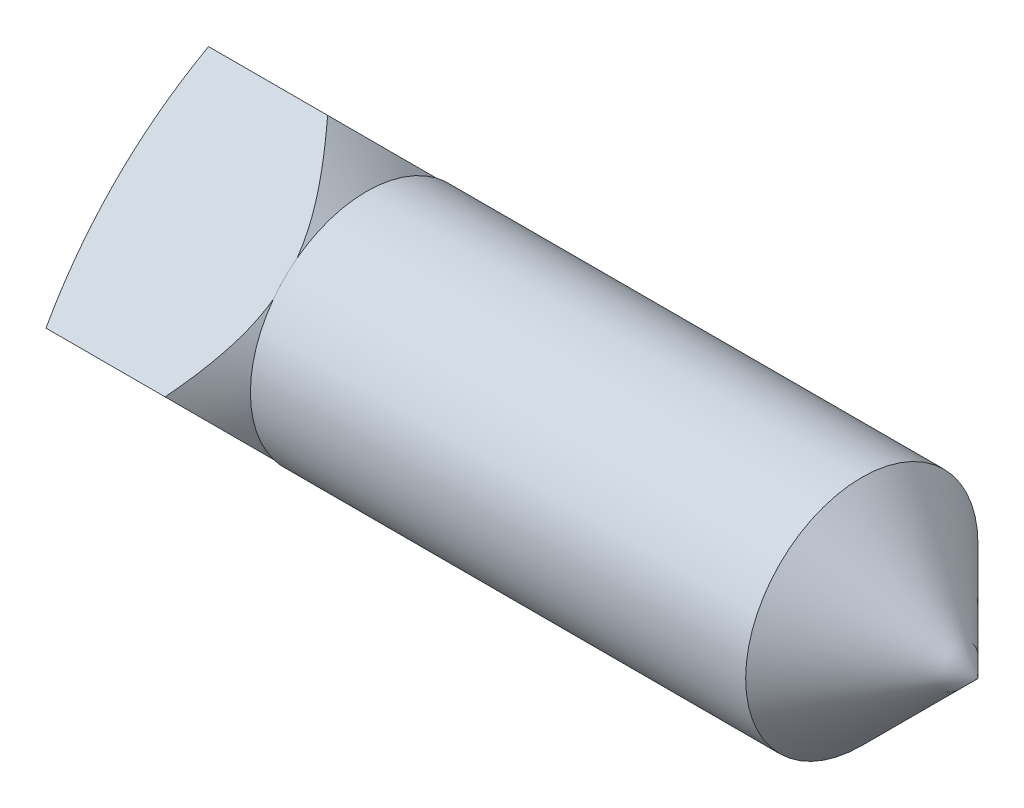
ISO-10303-21;
HEADER;
FILE_DESCRIPTION(('STEP AP214'),'2;1');
FILE_NAME('part.step','',(''),(''),'','','');
FILE_SCHEMA(('AUTOMOTIVE_DESIGN { 1 0 10303 214 1 1 1 1 }'));
ENDSEC;
DATA;
#1=APPLICATION_CONTEXT('core data for automotive mechanical design processes');
#2=APPLICATION_PROTOCOL_DEFINITION('international standard','automotive_design',2000,#1);
#3=PRODUCT_CONTEXT('',#1,'mechanical');
#4=PRODUCT('Part','Part','',(#3));
#5=PRODUCT_RELATED_PRODUCT_CATEGORY('part','',(#4));
#6=PRODUCT_DEFINITION_FORMATION('','',#4);
#7=PRODUCT_DEFINITION_CONTEXT('part definition',#1,'design');
#8=PRODUCT_DEFINITION('design','',#6,#7);
#9=PRODUCT_DEFINITION_SHAPE('','',#8);
#10=(LENGTH_UNIT() NAMED_UNIT(*) SI_UNIT(.MILLI.,.METRE.));
#11=(NAMED_UNIT(*) PLANE_ANGLE_UNIT() SI_UNIT($,.RADIAN.));
#12=(NAMED_UNIT(*) SI_UNIT($,.STERADIAN.) SOLID_ANGLE_UNIT());
#13=UNCERTAINTY_MEASURE_WITH_UNIT(LENGTH_MEASURE(1.E-05),#10,'distance_accuracy_value','');
#14=(GEOMETRIC_REPRESENTATION_CONTEXT(3) GLOBAL_UNCERTAINTY_ASSIGNED_CONTEXT((#13)) GLOBAL_UNIT_ASSIGNED_CONTEXT((#10,
#11,#12)) REPRESENTATION_CONTEXT('',''));
#15=CARTESIAN_POINT('',(0.,0.,0.));
#16=DIRECTION('',(0.,0.,1.));
#17=DIRECTION('',(1.,0.,0.));
#18=AXIS2_PLACEMENT_3D('',#15,#16,#17);
#19=CARTESIAN_POINT('',(-3.7592,0.,-3.376576301522));
#20=DIRECTION('',(0.,-0.707106781186549,0.707106781186546));
#21=DIRECTION('',(0.,-0.707106781186546,-0.707106781186549));
#22=AXIS2_PLACEMENT_3D('',#19,#20,#21);
#23=PLANE('',#22);
#24=CARTESIAN_POINT('',(-3.71463670391965,-2.84404188134766,-6.22061818286968));
#25=CARTESIAN_POINT('',(-3.55613835738031,-2.70146848632889,-6.07804478785091));
#26=CARTESIAN_POINT('',(-3.3981461725614,-2.55860959219922,-5.93518589372124));
#27=CARTESIAN_POINT('',(-3.08363247371533,-2.27203984223067,-5.64861614375269));
#28=CARTESIAN_POINT('',(-2.92711125800507,-2.12832882282157,-5.50490512434359));
#29=CARTESIAN_POINT('',(-2.61537743727245,-1.83919610910249,-5.2157724106245));
#30=CARTESIAN_POINT('',(-2.46017361078745,-1.69376967166462,-5.07034597318663));
#31=CARTESIAN_POINT('',(-2.15261018150916,-1.40143979481067,-4.77801609633269));
#32=CARTESIAN_POINT('',(-2.00025026783184,-1.25453651956937,-4.63111282109139));
#33=CARTESIAN_POINT('',(-1.72970912218957,-0.988182083810127,-4.36475838533214));
#34=CARTESIAN_POINT('',(-1.61078189630441,-0.869111186157922,-4.24568748767993));
#35=CARTESIAN_POINT('',(-1.37665028006823,-0.62910522635227,-4.00568152787428));
#36=CARTESIAN_POINT('',(-1.2614467785999,-0.508169729132244,-3.88474603065425));
#37=CARTESIAN_POINT('',(-1.03648369877529,-0.263755950580118,-3.64033225210213));
#38=CARTESIAN_POINT('',(-0.926724208648683,-0.140277628082979,-3.51685392960499));
#39=CARTESIAN_POINT('',(-0.7684117717571,0.0475823268502081,-3.3289939746718));
#40=CARTESIAN_POINT('',(-0.716703508322023,0.110632006865484,-3.26594429465652));
#41=CARTESIAN_POINT('',(-0.615958235242701,0.237786165781796,-3.13879013574021));
#42=CARTESIAN_POINT('',(-0.566920935267898,0.301890529049742,-3.07468577247226));
#43=CARTESIAN_POINT('',(-0.470564396194469,0.433616769365341,-2.94295953215667));
#44=CARTESIAN_POINT('',(-0.423365899696171,0.501283129317179,-2.87529317220483));
#45=CARTESIAN_POINT('',(-0.333664681644452,0.638144262361105,-2.7384320391609));
#46=CARTESIAN_POINT('',(-0.291160483356162,0.707338546531595,-2.66923775499041));
#47=CARTESIAN_POINT('',(-0.212295032056012,0.847303910790571,-2.52927239073143));
#48=CARTESIAN_POINT('',(-0.175920709426423,0.918071262430303,-2.4585050390917));
#49=CARTESIAN_POINT('',(-0.110910569940003,1.06137320930862,-2.31520309221338));
#50=CARTESIAN_POINT('',(-0.0822720790273512,1.13390718439999,-2.24266911712201));
#51=CARTESIAN_POINT('',(-0.0393755590361013,1.26582470943115,-2.11075159209085));
#52=CARTESIAN_POINT('',(-0.0233846612610307,1.32492428039639,-2.05165202112561));
#53=CARTESIAN_POINT('',(0.00161538214945569,1.44386018912425,-1.93271611239775));
#54=CARTESIAN_POINT('',(0.01062589901696,1.50369637983728,-1.87287992168473));
#55=CARTESIAN_POINT('',(0.0210920652181379,1.62355655088551,-1.75301975063649));
#56=CARTESIAN_POINT('',(0.0225662852538811,1.68357970456735,-1.69299659695465));
#57=CARTESIAN_POINT('',(0.0179155629650282,1.80348109631526,-1.57309520520674));
#58=CARTESIAN_POINT('',(0.0117896392073207,1.8633593146648,-1.5132169868572));
#59=CARTESIAN_POINT('',(-0.0100815229762265,1.99721927704997,-1.37935702447203));
#60=CARTESIAN_POINT('',(-0.0278264770273191,2.0710373829424,-1.30553891857961));
#61=CARTESIAN_POINT('',(-0.0730208692286259,2.21718932171447,-1.15938697980753));
#62=CARTESIAN_POINT('',(-0.100477023648008,2.28952209061008,-1.08705421091192));
#63=CARTESIAN_POINT('',(-0.147658550765414,2.39694211918634,-0.97963418233566));
#64=CARTESIAN_POINT('',(-0.16445563406514,2.43269379192944,-0.943882509592556));
#65=CARTESIAN_POINT('',(-0.199813441042721,2.50374093804668,-0.872835363475323));
#66=CARTESIAN_POINT('',(-0.218373328077732,2.53903661889179,-0.837539682630207));
#67=CARTESIAN_POINT('',(-0.257053416617413,2.60919264030522,-0.767383661216781));
#68=CARTESIAN_POINT('',(-0.277173505655789,2.64405301204261,-0.732523289479391));
#69=CARTESIAN_POINT('',(-0.31879132084626,2.71336326090943,-0.663213040612568));
#70=CARTESIAN_POINT('',(-0.340289202341565,2.74781309123004,-0.628763210291955));
#71=CARTESIAN_POINT('',(-0.403215402660207,2.84534321177681,-0.531233089745182));
#72=CARTESIAN_POINT('',(-0.446099723650983,2.90795472792716,-0.468621573594832));
#73=CARTESIAN_POINT('',(-0.535121543723193,3.03201522266659,-0.34456107885541));
#74=CARTESIAN_POINT('',(-0.581259746295166,3.09346394619475,-0.283112355327244));
#75=CARTESIAN_POINT('',(-0.723571645103508,3.27639274740933,-0.100183554112664));
#76=CARTESIAN_POINT('',(-0.823588743807215,3.39637526634609,0.0197989648240903));
#77=CARTESIAN_POINT('',(-1.03047356134524,3.63375592705894,0.257179625536947));
#78=CARTESIAN_POINT('',(-1.13735948771655,3.75114599014638,0.374569688624388));
#79=CARTESIAN_POINT('',(-1.3555789667849,3.98376603551817,0.607189733996177));
#80=CARTESIAN_POINT('',(-1.46691077768577,4.09899683825343,0.722420536731433));
#81=CARTESIAN_POINT('',(-1.69305612145303,4.32823502699326,0.951658725471272));
#82=CARTESIAN_POINT('',(-1.80787896298807,4.44223779677305,1.06566149525106));
#83=CARTESIAN_POINT('',(-2.03983717113577,4.66907271742692,1.29249641590493));
#84=CARTESIAN_POINT('',(-2.15697273510535,4.78190476713294,1.40532846561095));
#85=CARTESIAN_POINT('',(-2.39279712471293,5.00650286499344,1.62992656347145));
#86=CARTESIAN_POINT('',(-2.51148349733177,5.11827020377584,1.74169390225385));
#87=CARTESIAN_POINT('',(-2.75017246375149,5.34109999204903,1.96452369052705));
#88=CARTESIAN_POINT('',(-2.87017506440563,5.45216243786488,2.0755861363429));
#89=CARTESIAN_POINT('',(-3.05068333501773,5.61808795816654,2.24151165664455));
#90=CARTESIAN_POINT('',(-3.11080136898787,5.67316227631999,2.29658597479801));
#91=CARTESIAN_POINT('',(-3.23127854688798,5.78319708269407,2.40662078117208));
#92=CARTESIAN_POINT('',(-3.2916377379528,5.83815754511762,2.46158124359564));
#93=CARTESIAN_POINT('',(-3.41233885436045,5.94776482135316,2.57118851983118));
#94=CARTESIAN_POINT('',(-3.47268003281206,6.00241204656933,2.62583574504735));
#95=CARTESIAN_POINT('',(-3.59353260813615,6.11159399323991,2.73501769171792));
#96=CARTESIAN_POINT('',(-3.65404396700813,6.1661287357237,2.78955243420172));
#97=CARTESIAN_POINT('',(-3.71463670391965,6.22061818286967,2.84404188134768));
#98=B_SPLINE_CURVE_WITH_KNOTS('',3,(#24,#25,#26,#27,#28,#29,#30,#31,#32,#33,#34,#35,#36,#37,#38,
#39,#40,#41,#42,#43,#44,#45,#46,#47,#48,#49,#50,#51,#52,#53,#54,#55,#56,#57,#58,#59,#60,#61,#62,
#63,#64,#65,#66,#67,#68,#69,#70,#71,#72,#73,#74,#75,#76,#77,#78,#79,#80,#81,#82,#83,#84,#85,#86,
#87,#88,#89,#90,#91,#92,#93,#94,#95,#96,#97),.UNSPECIFIED.,.F.,.F.,(4,2,2,2,2,2,2,2,2,2,2,2,2,2,
2,2,2,2,2,2,2,2,2,2,2,2,2,2,2,2,2,2,2,2,2,2,4),(0.,0.769411594985046,1.53897600020602,
2.31192373762504,3.0847864790189,3.70321119591574,4.32178246157397,4.94036374898193,
5.24955145783677,5.55870549100782,5.87871228162844,6.19861811586591,6.51783299840492,
6.8369373958692,7.09196626841739,7.34694503015989,7.60129517747025,7.85567817332239,
8.17279662746613,8.49013483105983,8.64994152137469,8.80967274140047,8.9693924579743,
9.12913021439975,9.42418817492742,9.71931012383279,10.3099299987715,10.9021857726157,
11.4942117478058,12.0879855523367,12.6818102476393,13.2747881880488,13.8677692174056,
14.1629380958073,14.4581678026877,14.7523159011579,15.0464028402099),.UNSPECIFIED.);
#99=CARTESIAN_POINT('',(-0.808536519218278,0.,-3.376576301522));
#100=VERTEX_POINT('',#99);
#101=CARTESIAN_POINT('',(0.,1.44137193015166,-1.93520437137034));
#102=VERTEX_POINT('',#101);
#103=EDGE_CURVE('E156',#100,#102,#98,.T.);
#104=ORIENTED_EDGE('',*,*,#103,.F.);
#105=DIRECTION('',(1.,0.,0.));
#106=VECTOR('',#105,1.);
#107=CARTESIAN_POINT('',(-3.7592,0.,-3.376576301522));
#108=LINE('',#107,#106);
#109=CARTESIAN_POINT('',(-3.2823012150984,0.,-3.376576301522));
#110=VERTEX_POINT('',#109);
#111=EDGE_CURVE('E137',#110,#100,#108,.T.);
#112=ORIENTED_EDGE('',*,*,#111,.F.);
#113=CARTESIAN_POINT('',(8.4328,1.688288150761,-1.688288150761));
#114=DIRECTION('',(0.,-0.707106781186549,0.707106781186546));
#115=DIRECTION('',(0.,-0.707106781186546,-0.707106781186549));
#116=AXIS2_PLACEMENT_3D('',#113,#114,#115);
#117=CIRCLE('',#116,11.9559286648926);
#118=CARTESIAN_POINT('',(-3.2823012150984,3.376576301522,0.));
#119=VERTEX_POINT('',#118);
#120=EDGE_CURVE('E146',#119,#110,#117,.T.);
#121=ORIENTED_EDGE('',*,*,#120,.F.);
#122=DIRECTION('',(1.,0.,0.));
#123=VECTOR('',#122,1.);
#124=CARTESIAN_POINT('',(-3.7592,3.376576301522,0.));
#125=LINE('',#124,#123);
#126=CARTESIAN_POINT('',(-0.808536519218278,3.376576301522,0.));
#127=VERTEX_POINT('',#126);
#128=EDGE_CURVE('E144',#119,#127,#125,.T.);
#129=ORIENTED_EDGE('',*,*,#128,.T.);
#130=CARTESIAN_POINT('',(0.,1.93520437137034,-1.44137193015166));
#131=VERTEX_POINT('',#130);
#132=EDGE_CURVE('E166',#131,#127,#98,.T.);
#133=ORIENTED_EDGE('',*,*,#132,.F.);
#134=DIRECTION('',(0.,-0.707106781186546,-0.707106781186549));
#135=VECTOR('',#134,1.);
#136=CARTESIAN_POINT('',(0.,0.,-3.376576301522));
#137=LINE('',#136,#135);
#138=EDGE_CURVE('E40',#131,#102,#137,.T.);
#139=ORIENTED_EDGE('',*,*,#138,.T.);
#140=EDGE_LOOP('',(#104,#112,#121,#129,#133,#139));
#141=FACE_BOUND('',#140,.T.);
#142=ADVANCED_FACE('F32',(#141),#23,.F.);
#143=CARTESIAN_POINT('',(-3.7592,0.,-3.376576301522));
#144=DIRECTION('',(0.,0.707106781186546,0.707106781186549));
#145=DIRECTION('',(0.,-0.707106781186549,0.707106781186546));
#146=AXIS2_PLACEMENT_3D('',#143,#144,#145);
#147=PLANE('',#146);
#148=CARTESIAN_POINT('',(-3.71463670391965,-6.22061818286968,2.84404188134766));
#149=CARTESIAN_POINT('',(-3.55613835738031,-6.07804478785091,2.70146848632889));
#150=CARTESIAN_POINT('',(-3.3981461725614,-5.93518589372124,2.55860959219922));
#151=CARTESIAN_POINT('',(-3.08363247371533,-5.64861614375269,2.27203984223067));
#152=CARTESIAN_POINT('',(-2.92711125800507,-5.50490512434359,2.12832882282157));
#153=CARTESIAN_POINT('',(-2.61537743727245,-5.2157724106245,1.83919610910249));
#154=CARTESIAN_POINT('',(-2.46017361078745,-5.07034597318663,1.69376967166462));
#155=CARTESIAN_POINT('',(-2.15261018150916,-4.77801609633269,1.40143979481067));
#156=CARTESIAN_POINT('',(-2.00025026783184,-4.63111282109139,1.25453651956937));
#157=CARTESIAN_POINT('',(-1.72970912218957,-4.36475838533214,0.988182083810127));
#158=CARTESIAN_POINT('',(-1.61078189630441,-4.24568748767993,0.869111186157922));
#159=CARTESIAN_POINT('',(-1.37665028006823,-4.00568152787428,0.629105226352271));
#160=CARTESIAN_POINT('',(-1.2614467785999,-3.88474603065425,0.508169729132244));
#161=CARTESIAN_POINT('',(-1.03648369877529,-3.64033225210213,0.263755950580118));
#162=CARTESIAN_POINT('',(-0.926724208648684,-3.51685392960499,0.14027762808298));
#163=CARTESIAN_POINT('',(-0.768411771757102,-3.3289939746718,-0.0475823268502078));
#164=CARTESIAN_POINT('',(-0.716703508322024,-3.26594429465652,-0.110632006865485));
#165=CARTESIAN_POINT('',(-0.615958235242702,-3.13879013574021,-0.237786165781796));
#166=CARTESIAN_POINT('',(-0.566920935267899,-3.07468577247227,-0.301890529049741));
#167=CARTESIAN_POINT('',(-0.470564396194469,-2.94295953215667,-0.43361676936534));
#168=CARTESIAN_POINT('',(-0.423365899696171,-2.87529317220483,-0.501283129317179));
#169=CARTESIAN_POINT('',(-0.333664681644453,-2.7384320391609,-0.638144262361105));
#170=CARTESIAN_POINT('',(-0.291160483356162,-2.66923775499041,-0.707338546531596));
#171=CARTESIAN_POINT('',(-0.212295032056012,-2.52927239073143,-0.847303910790571));
#172=CARTESIAN_POINT('',(-0.175920709426423,-2.4585050390917,-0.918071262430302));
#173=CARTESIAN_POINT('',(-0.110910569940003,-2.31520309221338,-1.06137320930862));
#174=CARTESIAN_POINT('',(-0.0822720790273521,-2.24266911712201,-1.13390718439999));
#175=CARTESIAN_POINT('',(-0.0393755590361021,-2.11075159209085,-1.26582470943115));
#176=CARTESIAN_POINT('',(-0.0233846612610312,-2.05165202112561,-1.32492428039639));
#177=CARTESIAN_POINT('',(0.00161538214945543,-1.93271611239775,-1.44386018912425));
#178=CARTESIAN_POINT('',(0.0106258990169597,-1.87287992168473,-1.50369637983728));
#179=CARTESIAN_POINT('',(0.0210920652181375,-1.75301975063649,-1.62355655088551));
#180=CARTESIAN_POINT('',(0.0225662852538807,-1.69299659695465,-1.68357970456735));
#181=CARTESIAN_POINT('',(0.0179155629650279,-1.57309520520674,-1.80348109631526));
#182=CARTESIAN_POINT('',(0.0117896392073206,-1.5132169868572,-1.8633593146648));
#183=CARTESIAN_POINT('',(-0.0100815229762264,-1.37935702447203,-1.99721927704997));
#184=CARTESIAN_POINT('',(-0.0278264770273189,-1.30553891857961,-2.0710373829424));
#185=CARTESIAN_POINT('',(-0.0730208692286258,-1.15938697980753,-2.21718932171447));
#186=CARTESIAN_POINT('',(-0.100477023648008,-1.08705421091192,-2.28952209061008));
#187=CARTESIAN_POINT('',(-0.147658550765414,-0.979634182335661,-2.39694211918634));
#188=CARTESIAN_POINT('',(-0.16445563406514,-0.943882509592557,-2.43269379192944));
#189=CARTESIAN_POINT('',(-0.199813441042721,-0.872835363475324,-2.50374093804668));
#190=CARTESIAN_POINT('',(-0.218373328077731,-0.837539682630207,-2.53903661889179));
#191=CARTESIAN_POINT('',(-0.257053416617413,-0.76738366121678,-2.60919264030522));
#192=CARTESIAN_POINT('',(-0.277173505655789,-0.732523289479391,-2.64405301204261));
#193=CARTESIAN_POINT('',(-0.31879132084626,-0.663213040612568,-2.71336326090943));
#194=CARTESIAN_POINT('',(-0.340289202341565,-0.628763210291955,-2.74781309123004));
#195=CARTESIAN_POINT('',(-0.403215402660207,-0.531233089745183,-2.84534321177681));
#196=CARTESIAN_POINT('',(-0.446099723650983,-0.468621573594833,-2.90795472792716));
#197=CARTESIAN_POINT('',(-0.535121543723192,-0.34456107885541,-3.03201522266659));
#198=CARTESIAN_POINT('',(-0.581259746295166,-0.283112355327245,-3.09346394619475));
#199=CARTESIAN_POINT('',(-0.723571645103507,-0.100183554112666,-3.27639274740933));
#200=CARTESIAN_POINT('',(-0.823588743807214,0.0197989648240894,-3.39637526634609));
#201=CARTESIAN_POINT('',(-1.03047356134524,0.257179625536946,-3.63375592705894));
#202=CARTESIAN_POINT('',(-1.13735948771655,0.374569688624386,-3.75114599014638));
#203=CARTESIAN_POINT('',(-1.3555789667849,0.607189733996175,-3.98376603551817));
#204=CARTESIAN_POINT('',(-1.46691077768577,0.722420536731431,-4.09899683825342));
#205=CARTESIAN_POINT('',(-1.69305612145303,0.95165872547127,-4.32823502699326));
#206=CARTESIAN_POINT('',(-1.80787896298807,1.06566149525105,-4.44223779677305));
#207=CARTESIAN_POINT('',(-2.03983717113577,1.29249641590493,-4.66907271742692));
#208=CARTESIAN_POINT('',(-2.15697273510535,1.40532846561095,-4.78190476713294));
#209=CARTESIAN_POINT('',(-2.39279712471293,1.62992656347145,-5.00650286499344));
#210=CARTESIAN_POINT('',(-2.51148349733177,1.74169390225385,-5.11827020377584));
#211=CARTESIAN_POINT('',(-2.75017246375149,1.96452369052704,-5.34109999204903));
#212=CARTESIAN_POINT('',(-2.87017506440563,2.07558613634289,-5.45216243786488));
#213=CARTESIAN_POINT('',(-3.05068333501773,2.24151165664455,-5.61808795816653));
#214=CARTESIAN_POINT('',(-3.11080136898787,2.29658597479801,-5.67316227631999));
#215=CARTESIAN_POINT('',(-3.23127854688798,2.40662078117208,-5.78319708269407));
#216=CARTESIAN_POINT('',(-3.2916377379528,2.46158124359564,-5.83815754511762));
#217=CARTESIAN_POINT('',(-3.41233885436045,2.57118851983118,-5.94776482135316));
#218=CARTESIAN_POINT('',(-3.47268003281206,2.62583574504735,-6.00241204656933));
#219=CARTESIAN_POINT('',(-3.59353260813615,2.73501769171792,-6.11159399323991));
#220=CARTESIAN_POINT('',(-3.65404396700813,2.78955243420172,-6.1661287357237));
#221=CARTESIAN_POINT('',(-3.71463670391965,2.84404188134768,-6.22061818286967));
#222=B_SPLINE_CURVE_WITH_KNOTS('',3,(#148,#149,#150,#151,#152,#153,#154,#155,#156,#157,#158,
#159,#160,#161,#162,#163,#164,#165,#166,#167,#168,#169,#170,#171,#172,#173,#174,#175,#176,#177,
#178,#179,#180,#181,#182,#183,#184,#185,#186,#187,#188,#189,#190,#191,#192,#193,#194,#195,#196,
#197,#198,#199,#200,#201,#202,#203,#204,#205,#206,#207,#208,#209,#210,#211,#212,#213,#214,#215,
#216,#217,#218,#219,#220,#221),.UNSPECIFIED.,.F.,.F.,(4,2,2,2,2,2,2,2,2,2,2,2,2,2,2,2,2,2,2,2,2,
2,2,2,2,2,2,2,2,2,2,2,2,2,2,2,4),(0.,0.769411594985046,1.53897600020603,2.31192373762504,
3.0847864790189,3.70321119591574,4.32178246157397,4.94036374898192,5.24955145783677,
5.55870549100782,5.87871228162844,6.19861811586591,6.51783299840492,6.8369373958692,
7.09196626841739,7.34694503015989,7.60129517747025,7.85567817332239,8.17279662746613,
8.49013483105983,8.64994152137469,8.80967274140047,8.9693924579743,9.12913021439976,
9.42418817492742,9.71931012383279,10.3099299987715,10.9021857726157,11.4942117478058,
12.0879855523367,12.6818102476393,13.2747881880488,13.8677692174056,14.1629380958073,
14.4581678026877,14.7523159011579,15.0464028402099),.UNSPECIFIED.);
#223=CARTESIAN_POINT('',(-0.808536519218278,-3.376576301522,0.));
#224=VERTEX_POINT('',#223);
#225=CARTESIAN_POINT('',(0.,-1.93520437137034,-1.44137193015166));
#226=VERTEX_POINT('',#225);
#227=EDGE_CURVE('E157',#224,#226,#222,.T.);
#228=ORIENTED_EDGE('',*,*,#227,.F.);
#229=DIRECTION('',(1.,0.,0.));
#230=VECTOR('',#229,1.);
#231=CARTESIAN_POINT('',(-3.7592,-3.376576301522,0.));
#232=LINE('',#231,#230);
#233=CARTESIAN_POINT('',(-3.2823012150984,-3.376576301522,0.));
#234=VERTEX_POINT('',#233);
#235=EDGE_CURVE('E140',#234,#224,#232,.T.);
#236=ORIENTED_EDGE('',*,*,#235,.F.);
#237=CARTESIAN_POINT('',(8.4328,-1.688288150761,-1.688288150761));
#238=DIRECTION('',(0.,0.707106781186546,0.707106781186549));
#239=DIRECTION('',(0.,-0.707106781186549,0.707106781186546));
#240=AXIS2_PLACEMENT_3D('',#237,#238,#239);
#241=CIRCLE('',#240,11.9559286648926);
#242=EDGE_CURVE('E153',#110,#234,#241,.T.);
#243=ORIENTED_EDGE('',*,*,#242,.F.);
#244=ORIENTED_EDGE('',*,*,#111,.T.);
#245=CARTESIAN_POINT('',(0.,-1.44137193015166,-1.93520437137034));
#246=VERTEX_POINT('',#245);
#247=EDGE_CURVE('E164',#246,#100,#222,.T.);
#248=ORIENTED_EDGE('',*,*,#247,.F.);
#249=DIRECTION('',(0.,-0.707106781186549,0.707106781186546));
#250=VECTOR('',#249,1.);
#251=CARTESIAN_POINT('',(0.,0.,-3.376576301522));
#252=LINE('',#251,#250);
#253=EDGE_CURVE('E130',#246,#226,#252,.T.);
#254=ORIENTED_EDGE('',*,*,#253,.T.);
#255=EDGE_LOOP('',(#228,#236,#243,#244,#248,#254));
#256=FACE_BOUND('',#255,.T.);
#257=ADVANCED_FACE('F172',(#256),#147,.F.);
#258=CARTESIAN_POINT('',(-3.7592,-3.376576301522,0.));
#259=DIRECTION('',(0.,0.707106781186549,-0.707106781186546));
#260=DIRECTION('',(0.,0.707106781186546,0.707106781186549));
#261=AXIS2_PLACEMENT_3D('',#258,#259,#260);
#262=PLANE('',#261);
#263=CARTESIAN_POINT('',(-3.71463670391965,2.84404188134766,6.22061818286968));
#264=CARTESIAN_POINT('',(-3.55613835738031,2.70146848632889,6.07804478785091));
#265=CARTESIAN_POINT('',(-3.3981461725614,2.55860959219922,5.93518589372124));
#266=CARTESIAN_POINT('',(-3.08363247371533,2.27203984223067,5.64861614375269));
#267=CARTESIAN_POINT('',(-2.92711125800507,2.12832882282157,5.50490512434359));
#268=CARTESIAN_POINT('',(-2.61537743727245,1.83919610910249,5.2157724106245));
#269=CARTESIAN_POINT('',(-2.46017361078745,1.69376967166462,5.07034597318663));
#270=CARTESIAN_POINT('',(-2.15261018150916,1.40143979481067,4.77801609633269));
#271=CARTESIAN_POINT('',(-2.00025026783184,1.25453651956937,4.63111282109139));
#272=CARTESIAN_POINT('',(-1.72970912218957,0.988182083810127,4.36475838533214));
#273=CARTESIAN_POINT('',(-1.61078189630441,0.869111186157923,4.24568748767993));
#274=CARTESIAN_POINT('',(-1.37665028006823,0.629105226352271,4.00568152787428));
#275=CARTESIAN_POINT('',(-1.2614467785999,0.508169729132245,3.88474603065425));
#276=CARTESIAN_POINT('',(-1.03648369877529,0.263755950580118,3.64033225210213));
#277=CARTESIAN_POINT('',(-0.926724208648684,0.14027762808298,3.51685392960499));
#278=CARTESIAN_POINT('',(-0.768411771757101,-0.0475823268502077,3.3289939746718));
#279=CARTESIAN_POINT('',(-0.716703508322023,-0.110632006865484,3.26594429465652));
#280=CARTESIAN_POINT('',(-0.615958235242701,-0.237786165781796,3.13879013574021));
#281=CARTESIAN_POINT('',(-0.566920935267899,-0.301890529049741,3.07468577247227));
#282=CARTESIAN_POINT('',(-0.470564396194469,-0.43361676936534,2.94295953215667));
#283=CARTESIAN_POINT('',(-0.423365899696171,-0.501283129317179,2.87529317220483));
#284=CARTESIAN_POINT('',(-0.333664681644453,-0.638144262361105,2.7384320391609));
#285=CARTESIAN_POINT('',(-0.291160483356162,-0.707338546531595,2.66923775499041));
#286=CARTESIAN_POINT('',(-0.212295032056012,-0.84730391079057,2.52927239073143));
#287=CARTESIAN_POINT('',(-0.175920709426424,-0.918071262430302,2.4585050390917));
#288=CARTESIAN_POINT('',(-0.110910569940003,-1.06137320930862,2.31520309221338));
#289=CARTESIAN_POINT('',(-0.0822720790273513,-1.13390718439999,2.24266911712201));
#290=CARTESIAN_POINT('',(-0.0393755590361015,-1.26582470943115,2.11075159209085));
#291=CARTESIAN_POINT('',(-0.0233846612610312,-1.32492428039639,2.05165202112561));
#292=CARTESIAN_POINT('',(0.00161538214945522,-1.44386018912425,1.93271611239775));
#293=CARTESIAN_POINT('',(0.0106258990169598,-1.50369637983728,1.87287992168473));
#294=CARTESIAN_POINT('',(0.0210920652181375,-1.62355655088551,1.75301975063649));
#295=CARTESIAN_POINT('',(0.0225662852538803,-1.68357970456735,1.69299659695465));
#296=CARTESIAN_POINT('',(0.0179155629650275,-1.80348109631526,1.57309520520674));
#297=CARTESIAN_POINT('',(0.0117896392073205,-1.8633593146648,1.5132169868572));
#298=CARTESIAN_POINT('',(-0.0100815229762263,-1.99721927704997,1.37935702447203));
#299=CARTESIAN_POINT('',(-0.027826477027319,-2.0710373829424,1.30553891857961));
#300=CARTESIAN_POINT('',(-0.0730208692286261,-2.21718932171447,1.15938697980753));
#301=CARTESIAN_POINT('',(-0.100477023648008,-2.28952209061008,1.08705421091192));
#302=CARTESIAN_POINT('',(-0.147658550765414,-2.39694211918634,0.97963418233566));
#303=CARTESIAN_POINT('',(-0.16445563406514,-2.43269379192944,0.943882509592556));
#304=CARTESIAN_POINT('',(-0.199813441042722,-2.50374093804668,0.872835363475323));
#305=CARTESIAN_POINT('',(-0.218373328077732,-2.53903661889179,0.837539682630206));
#306=CARTESIAN_POINT('',(-0.257053416617413,-2.60919264030522,0.767383661216781));
#307=CARTESIAN_POINT('',(-0.277173505655789,-2.64405301204261,0.732523289479391));
#308=CARTESIAN_POINT('',(-0.31879132084626,-2.71336326090943,0.663213040612568));
#309=CARTESIAN_POINT('',(-0.340289202341565,-2.74781309123004,0.628763210291955));
#310=CARTESIAN_POINT('',(-0.403215402660207,-2.84534321177681,0.531233089745183));
#311=CARTESIAN_POINT('',(-0.446099723650983,-2.90795472792716,0.468621573594833));
#312=CARTESIAN_POINT('',(-0.535121543723192,-3.03201522266659,0.34456107885541));
#313=CARTESIAN_POINT('',(-0.581259746295166,-3.09346394619475,0.283112355327245));
#314=CARTESIAN_POINT('',(-0.723571645103507,-3.27639274740933,0.100183554112665));
#315=CARTESIAN_POINT('',(-0.823588743807214,-3.39637526634609,-0.0197989648240894));
#316=CARTESIAN_POINT('',(-1.03047356134524,-3.63375592705894,-0.257179625536946));
#317=CARTESIAN_POINT('',(-1.13735948771655,-3.75114599014638,-0.374569688624387));
#318=CARTESIAN_POINT('',(-1.3555789667849,-3.98376603551817,-0.607189733996175));
#319=CARTESIAN_POINT('',(-1.46691077768577,-4.09899683825342,-0.722420536731431));
#320=CARTESIAN_POINT('',(-1.69305612145303,-4.32823502699326,-0.95165872547127));
#321=CARTESIAN_POINT('',(-1.80787896298807,-4.44223779677305,-1.06566149525105));
#322=CARTESIAN_POINT('',(-2.03983717113577,-4.66907271742692,-1.29249641590493));
#323=CARTESIAN_POINT('',(-2.15697273510535,-4.78190476713294,-1.40532846561095));
#324=CARTESIAN_POINT('',(-2.39279712471293,-5.00650286499344,-1.62992656347145));
#325=CARTESIAN_POINT('',(-2.51148349733177,-5.11827020377584,-1.74169390225385));
#326=CARTESIAN_POINT('',(-2.75017246375149,-5.34109999204903,-1.96452369052704));
#327=CARTESIAN_POINT('',(-2.87017506440563,-5.45216243786488,-2.07558613634289));
#328=CARTESIAN_POINT('',(-3.05068333501773,-5.61808795816653,-2.24151165664455));
#329=CARTESIAN_POINT('',(-3.11080136898787,-5.67316227631999,-2.296585974798));
#330=CARTESIAN_POINT('',(-3.23127854688798,-5.78319708269407,-2.40662078117208));
#331=CARTESIAN_POINT('',(-3.29163773795279,-5.83815754511762,-2.46158124359564));
#332=CARTESIAN_POINT('',(-3.41233885436045,-5.94776482135316,-2.57118851983118));
#333=CARTESIAN_POINT('',(-3.47268003281206,-6.00241204656933,-2.62583574504735));
#334=CARTESIAN_POINT('',(-3.59353260813615,-6.11159399323991,-2.73501769171792));
#335=CARTESIAN_POINT('',(-3.65404396700813,-6.1661287357237,-2.78955243420172));
#336=CARTESIAN_POINT('',(-3.71463670391965,-6.22061818286967,-2.84404188134768));
#337=B_SPLINE_CURVE_WITH_KNOTS('',3,(#263,#264,#265,#266,#267,#268,#269,#270,#271,#272,#273,
#274,#275,#276,#277,#278,#279,#280,#281,#282,#283,#284,#285,#286,#287,#288,#289,#290,#291,#292,
#293,#294,#295,#296,#297,#298,#299,#300,#301,#302,#303,#304,#305,#306,#307,#308,#309,#310,#311,
#312,#313,#314,#315,#316,#317,#318,#319,#320,#321,#322,#323,#324,#325,#326,#327,#328,#329,#330,
#331,#332,#333,#334,#335,#336),.UNSPECIFIED.,.F.,.F.,(4,2,2,2,2,2,2,2,2,2,2,2,2,2,2,2,2,2,2,2,2,
2,2,2,2,2,2,2,2,2,2,2,2,2,2,2,4),(0.,0.769411594985046,1.53897600020603,2.31192373762504,
3.0847864790189,3.70321119591574,4.32178246157397,4.94036374898192,5.24955145783677,
5.55870549100782,5.87871228162844,6.19861811586591,6.51783299840492,6.8369373958692,
7.09196626841739,7.34694503015989,7.60129517747024,7.85567817332239,8.17279662746613,
8.49013483105983,8.64994152137469,8.80967274140047,8.9693924579743,9.12913021439975,
9.42418817492741,9.71931012383279,10.3099299987715,10.9021857726157,11.4942117478058,
12.0879855523367,12.6818102476393,13.2747881880488,13.8677692174056,14.1629380958073,
14.4581678026877,14.7523159011579,15.0464028402099),.UNSPECIFIED.);
#338=CARTESIAN_POINT('',(-0.808536519218278,0.,3.376576301522));
#339=VERTEX_POINT('',#338);
#340=CARTESIAN_POINT('',(0.,-1.44137193015166,1.93520437137034));
#341=VERTEX_POINT('',#340);
#342=EDGE_CURVE('E54',#339,#341,#337,.T.);
#343=ORIENTED_EDGE('',*,*,#342,.F.);
#344=DIRECTION('',(1.,0.,0.));
#345=VECTOR('',#344,1.);
#346=CARTESIAN_POINT('',(-3.7592,0.,3.376576301522));
#347=LINE('',#346,#345);
#348=CARTESIAN_POINT('',(-3.2823012150984,0.,3.376576301522));
#349=VERTEX_POINT('',#348);
#350=EDGE_CURVE('E118',#349,#339,#347,.T.);
#351=ORIENTED_EDGE('',*,*,#350,.F.);
#352=CARTESIAN_POINT('',(8.4328,-1.688288150761,1.688288150761));
#353=DIRECTION('',(0.,0.707106781186549,-0.707106781186546));
#354=DIRECTION('',(0.,0.707106781186546,0.707106781186549));
#355=AXIS2_PLACEMENT_3D('',#352,#353,#354);
#356=CIRCLE('',#355,11.9559286648926);
#357=EDGE_CURVE('E46',#234,#349,#356,.T.);
#358=ORIENTED_EDGE('',*,*,#357,.F.);
#359=ORIENTED_EDGE('',*,*,#235,.T.);
#360=CARTESIAN_POINT('',(0.,-1.93520437137034,1.44137193015166));
#361=VERTEX_POINT('',#360);
#362=EDGE_CURVE('E165',#361,#224,#337,.T.);
#363=ORIENTED_EDGE('',*,*,#362,.F.);
#364=DIRECTION('',(0.,0.707106781186546,0.707106781186549));
#365=VECTOR('',#364,1.);
#366=CARTESIAN_POINT('',(0.,-3.376576301522,0.));
#367=LINE('',#366,#365);
#368=EDGE_CURVE('E124',#361,#341,#367,.T.);
#369=ORIENTED_EDGE('',*,*,#368,.T.);
#370=EDGE_LOOP('',(#343,#351,#358,#359,#363,#369));
#371=FACE_BOUND('',#370,.T.);
#372=ADVANCED_FACE('F193',(#371),#262,.F.);
#373=CARTESIAN_POINT('',(-3.7592,3.376576301522,0.));
#374=DIRECTION('',(0.,-0.707106781186546,-0.707106781186549));
#375=DIRECTION('',(0.,0.707106781186549,-0.707106781186546));
#376=AXIS2_PLACEMENT_3D('',#373,#374,#375);
#377=PLANE('',#376);
#378=CARTESIAN_POINT('',(-3.71463670391965,6.22061818286968,-2.84404188134766));
#379=CARTESIAN_POINT('',(-3.55613835738031,6.07804478785091,-2.70146848632889));
#380=CARTESIAN_POINT('',(-3.3981461725614,5.93518589372124,-2.55860959219922));
#381=CARTESIAN_POINT('',(-3.08363247371533,5.64861614375269,-2.27203984223067));
#382=CARTESIAN_POINT('',(-2.92711125800507,5.50490512434359,-2.12832882282157));
#383=CARTESIAN_POINT('',(-2.61537743727245,5.2157724106245,-1.83919610910249));
#384=CARTESIAN_POINT('',(-2.46017361078745,5.07034597318663,-1.69376967166462));
#385=CARTESIAN_POINT('',(-2.15261018150916,4.77801609633269,-1.40143979481067));
#386=CARTESIAN_POINT('',(-2.00025026783184,4.63111282109139,-1.25453651956937));
#387=CARTESIAN_POINT('',(-1.72970912218957,4.36475838533214,-0.988182083810126));
#388=CARTESIAN_POINT('',(-1.61078189630441,4.24568748767993,-0.869111186157922));
#389=CARTESIAN_POINT('',(-1.37665028006823,4.00568152787428,-0.62910522635227));
#390=CARTESIAN_POINT('',(-1.2614467785999,3.88474603065425,-0.508169729132244));
#391=CARTESIAN_POINT('',(-1.03648369877529,3.64033225210213,-0.263755950580118));
#392=CARTESIAN_POINT('',(-0.926724208648683,3.51685392960499,-0.14027762808298));
#393=CARTESIAN_POINT('',(-0.7684117717571,3.3289939746718,0.0475823268502082));
#394=CARTESIAN_POINT('',(-0.716703508322023,3.26594429465652,0.110632006865485));
#395=CARTESIAN_POINT('',(-0.615958235242701,3.13879013574021,0.237786165781797));
#396=CARTESIAN_POINT('',(-0.566920935267897,3.07468577247226,0.301890529049742));
#397=CARTESIAN_POINT('',(-0.470564396194468,2.94295953215666,0.433616769365342));
#398=CARTESIAN_POINT('',(-0.42336589969617,2.87529317220483,0.50128312931718));
#399=CARTESIAN_POINT('',(-0.333664681644452,2.7384320391609,0.638144262361106));
#400=CARTESIAN_POINT('',(-0.291160483356161,2.66923775499041,0.707338546531596));
#401=CARTESIAN_POINT('',(-0.212295032056012,2.52927239073143,0.847303910790571));
#402=CARTESIAN_POINT('',(-0.175920709426423,2.4585050390917,0.918071262430303));
#403=CARTESIAN_POINT('',(-0.110910569940003,2.31520309221338,1.06137320930862));
#404=CARTESIAN_POINT('',(-0.0822720790273508,2.24266911712201,1.13390718439999));
#405=CARTESIAN_POINT('',(-0.0393755590361008,2.11075159209085,1.26582470943115));
#406=CARTESIAN_POINT('',(-0.0233846612610303,2.05165202112561,1.3249242803964));
#407=CARTESIAN_POINT('',(0.00161538214945619,1.93271611239775,1.44386018912425));
#408=CARTESIAN_POINT('',(0.0106258990169606,1.87287992168472,1.50369637983728));
#409=CARTESIAN_POINT('',(0.0210920652181382,1.75301975063649,1.62355655088551));
#410=CARTESIAN_POINT('',(0.0225662852538811,1.69299659695465,1.68357970456735));
#411=CARTESIAN_POINT('',(0.0179155629650281,1.57309520520674,1.80348109631526));
#412=CARTESIAN_POINT('',(0.0117896392073209,1.5132169868572,1.8633593146648));
#413=CARTESIAN_POINT('',(-0.0100815229762263,1.37935702447203,1.99721927704997));
#414=CARTESIAN_POINT('',(-0.0278264770273194,1.3055389185796,2.0710373829424));
#415=CARTESIAN_POINT('',(-0.0730208692286265,1.15938697980753,2.21718932171447));
#416=CARTESIAN_POINT('',(-0.100477023648008,1.08705421091191,2.28952209061009));
#417=CARTESIAN_POINT('',(-0.147658550765415,0.979634182335658,2.39694211918634));
#418=CARTESIAN_POINT('',(-0.164455634065141,0.943882509592554,2.43269379192944));
#419=CARTESIAN_POINT('',(-0.199813441042723,0.872835363475321,2.50374093804668));
#420=CARTESIAN_POINT('',(-0.218373328077733,0.837539682630204,2.53903661889179));
#421=CARTESIAN_POINT('',(-0.257053416617414,0.767383661216778,2.60919264030522));
#422=CARTESIAN_POINT('',(-0.27717350565579,0.732523289479389,2.64405301204261));
#423=CARTESIAN_POINT('',(-0.318791320846261,0.663213040612566,2.71336326090943));
#424=CARTESIAN_POINT('',(-0.340289202341565,0.628763210291953,2.74781309123004));
#425=CARTESIAN_POINT('',(-0.403215402660208,0.531233089745182,2.84534321177682));
#426=CARTESIAN_POINT('',(-0.446099723650983,0.468621573594832,2.90795472792716));
#427=CARTESIAN_POINT('',(-0.535121543723193,0.344561078855409,3.03201522266659));
#428=CARTESIAN_POINT('',(-0.581259746295167,0.283112355327243,3.09346394619475));
#429=CARTESIAN_POINT('',(-0.723571645103508,0.100183554112663,3.27639274740933));
#430=CARTESIAN_POINT('',(-0.823588743807216,-0.0197989648240921,3.39637526634609));
#431=CARTESIAN_POINT('',(-1.03047356134524,-0.257179625536949,3.63375592705894));
#432=CARTESIAN_POINT('',(-1.13735948771656,-0.37456968862439,3.75114599014638));
#433=CARTESIAN_POINT('',(-1.3555789667849,-0.607189733996178,3.98376603551817));
#434=CARTESIAN_POINT('',(-1.46691077768577,-0.722420536731434,4.09899683825343));
#435=CARTESIAN_POINT('',(-1.69305612145304,-0.951658725471274,4.32823502699327));
#436=CARTESIAN_POINT('',(-1.80787896298807,-1.06566149525106,4.44223779677305));
#437=CARTESIAN_POINT('',(-2.03983717113577,-1.29249641590493,4.66907271742692));
#438=CARTESIAN_POINT('',(-2.15697273510536,-1.40532846561095,4.78190476713294));
#439=CARTESIAN_POINT('',(-2.39279712471293,-1.62992656347146,5.00650286499345));
#440=CARTESIAN_POINT('',(-2.51148349733177,-1.74169390225385,5.11827020377584));
#441=CARTESIAN_POINT('',(-2.7501724637515,-1.96452369052705,5.34109999204904));
#442=CARTESIAN_POINT('',(-2.87017506440564,-2.0755861363429,5.45216243786489));
#443=CARTESIAN_POINT('',(-3.05068333501774,-2.24151165664455,5.61808795816654));
#444=CARTESIAN_POINT('',(-3.11080136898788,-2.29658597479801,5.67316227632));
#445=CARTESIAN_POINT('',(-3.23127854688799,-2.40662078117208,5.78319708269407));
#446=CARTESIAN_POINT('',(-3.2916377379528,-2.46158124359564,5.83815754511763));
#447=CARTESIAN_POINT('',(-3.41233885436046,-2.57118851983118,5.94776482135317));
#448=CARTESIAN_POINT('',(-3.47268003281206,-2.62583574504735,6.00241204656933));
#449=CARTESIAN_POINT('',(-3.59353260813615,-2.73501769171792,6.11159399323991));
#450=CARTESIAN_POINT('',(-3.65404396700814,-2.78955243420172,6.1661287357237));
#451=CARTESIAN_POINT('',(-3.71463670391965,-2.84404188134768,6.22061818286967));
#452=B_SPLINE_CURVE_WITH_KNOTS('',3,(#378,#379,#380,#381,#382,#383,#384,#385,#386,#387,#388,
#389,#390,#391,#392,#393,#394,#395,#396,#397,#398,#399,#400,#401,#402,#403,#404,#405,#406,#407,
#408,#409,#410,#411,#412,#413,#414,#415,#416,#417,#418,#419,#420,#421,#422,#423,#424,#425,#426,
#427,#428,#429,#430,#431,#432,#433,#434,#435,#436,#437,#438,#439,#440,#441,#442,#443,#444,#445,
#446,#447,#448,#449,#450,#451),.UNSPECIFIED.,.F.,.F.,(4,2,2,2,2,2,2,2,2,2,2,2,2,2,2,2,2,2,2,2,2,
2,2,2,2,2,2,2,2,2,2,2,2,2,2,2,4),(0.,0.769411594985046,1.53897600020603,2.31192373762504,
3.0847864790189,3.70321119591574,4.32178246157397,4.94036374898193,5.24955145783677,
5.55870549100782,5.87871228162844,6.19861811586592,6.51783299840492,6.8369373958692,
7.09196626841739,7.34694503015989,7.60129517747025,7.85567817332239,8.17279662746613,
8.49013483105983,8.6499415213747,8.80967274140047,8.96939245797431,9.12913021439976,
9.42418817492742,9.7193101238328,10.3099299987715,10.9021857726157,11.4942117478058,
12.0879855523367,12.6818102476393,13.2747881880488,13.8677692174057,14.1629380958073,
14.4581678026877,14.7523159011579,15.0464028402099),.UNSPECIFIED.);
#453=CARTESIAN_POINT('',(0.,1.93520437137034,1.44137193015166));
#454=VERTEX_POINT('',#453);
#455=EDGE_CURVE('E120',#127,#454,#452,.T.);
#456=ORIENTED_EDGE('',*,*,#455,.F.);
#457=ORIENTED_EDGE('',*,*,#128,.F.);
#458=CARTESIAN_POINT('',(8.4328,1.688288150761,1.688288150761));
#459=DIRECTION('',(0.,-0.707106781186546,-0.707106781186549));
#460=DIRECTION('',(0.,0.707106781186549,-0.707106781186546));
#461=AXIS2_PLACEMENT_3D('',#458,#459,#460);
#462=CIRCLE('',#461,11.9559286648926);
#463=EDGE_CURVE('E11',#349,#119,#462,.T.);
#464=ORIENTED_EDGE('',*,*,#463,.F.);
#465=ORIENTED_EDGE('',*,*,#350,.T.);
#466=CARTESIAN_POINT('',(0.,1.44137193015166,1.93520437137034));
#467=VERTEX_POINT('',#466);
#468=EDGE_CURVE('E102',#467,#339,#452,.T.);
#469=ORIENTED_EDGE('',*,*,#468,.F.);
#470=DIRECTION('',(0.,0.707106781186549,-0.707106781186546));
#471=VECTOR('',#470,1.);
#472=CARTESIAN_POINT('',(0.,3.376576301522,0.));
#473=LINE('',#472,#471);
#474=EDGE_CURVE('E116',#467,#454,#473,.T.);
#475=ORIENTED_EDGE('',*,*,#474,.T.);
#476=EDGE_LOOP('',(#456,#457,#464,#465,#469,#475));
#477=FACE_BOUND('',#476,.T.);
#478=ADVANCED_FACE('F115',(#477),#377,.F.);
#479=CARTESIAN_POINT('',(0.,0.,0.));
#480=DIRECTION('',(-1.,0.,0.));
#481=DIRECTION('',(0.,0.,1.));
#482=AXIS2_PLACEMENT_3D('',#479,#480,#481);
#483=PLANE('',#482);
#484=ORIENTED_EDGE('',*,*,#138,.F.);
#485=CARTESIAN_POINT('',(0.,0.,0.));
#486=DIRECTION('',(-1.,0.,0.));
#487=DIRECTION('',(0.,0.,1.));
#488=AXIS2_PLACEMENT_3D('',#485,#486,#487);
#489=CIRCLE('',#488,2.413);
#490=EDGE_CURVE('E133',#131,#102,#489,.T.);
#491=ORIENTED_EDGE('',*,*,#490,.T.);
#492=EDGE_LOOP('',(#484,#491));
#493=FACE_BOUND('',#492,.T.);
#494=ADVANCED_FACE('F199',(#493),#483,.T.);
#495=ORIENTED_EDGE('',*,*,#474,.F.);
#496=EDGE_CURVE('E109',#467,#454,#489,.T.);
#497=ORIENTED_EDGE('',*,*,#496,.T.);
#498=EDGE_LOOP('',(#495,#497));
#499=FACE_BOUND('',#498,.T.);
#500=ADVANCED_FACE('F123',(#499),#483,.T.);
#501=ORIENTED_EDGE('',*,*,#368,.F.);
#502=EDGE_CURVE('E107',#361,#341,#489,.T.);
#503=ORIENTED_EDGE('',*,*,#502,.T.);
#504=EDGE_LOOP('',(#501,#503));
#505=FACE_BOUND('',#504,.T.);
#506=ADVANCED_FACE('F221',(#505),#483,.T.);
#507=ORIENTED_EDGE('',*,*,#253,.F.);
#508=EDGE_CURVE('E232',#246,#226,#489,.T.);
#509=ORIENTED_EDGE('',*,*,#508,.T.);
#510=EDGE_LOOP('',(#507,#509));
#511=FACE_BOUND('',#510,.T.);
#512=ADVANCED_FACE('F34',(#511),#483,.T.);
#513=CARTESIAN_POINT('',(-12.7,0.,0.));
#514=DIRECTION('',(-1.,0.,0.));
#515=DIRECTION('',(0.,0.,1.));
#516=AXIS2_PLACEMENT_3D('',#513,#514,#515);
#517=CYLINDRICAL_SURFACE('',#516,2.413);
#518=CARTESIAN_POINT('',(10.287,0.,0.));
#519=DIRECTION('',(-1.,0.,0.));
#520=DIRECTION('',(0.,0.,1.));
#521=AXIS2_PLACEMENT_3D('',#518,#519,#520);
#522=CIRCLE('',#521,2.413);
#523=CARTESIAN_POINT('',(10.287,0.,2.413));
#524=VERTEX_POINT('',#523);
#525=EDGE_CURVE('E108',#524,#524,#522,.T.);
#526=ORIENTED_EDGE('',*,*,#525,.T.);
#527=EDGE_LOOP('',(#526));
#528=FACE_BOUND('',#527,.T.);
#529=ORIENTED_EDGE('',*,*,#496,.F.);
#530=EDGE_CURVE('E99',#341,#467,#489,.T.);
#531=ORIENTED_EDGE('',*,*,#530,.F.);
#532=ORIENTED_EDGE('',*,*,#502,.F.);
#533=EDGE_CURVE('E239',#226,#361,#489,.T.);
#534=ORIENTED_EDGE('',*,*,#533,.F.);
#535=ORIENTED_EDGE('',*,*,#508,.F.);
#536=EDGE_CURVE('E237',#102,#246,#489,.T.);
#537=ORIENTED_EDGE('',*,*,#536,.F.);
#538=ORIENTED_EDGE('',*,*,#490,.F.);
#539=EDGE_CURVE('E129',#454,#131,#489,.T.);
#540=ORIENTED_EDGE('',*,*,#539,.F.);
#541=EDGE_LOOP('',(#529,#531,#532,#534,#535,#537,#538,#540));
#542=FACE_BOUND('',#541,.T.);
#543=ADVANCED_FACE('F127',(#528,#542),#517,.T.);
#544=CARTESIAN_POINT('',(10.287,0.,0.));
#545=DIRECTION('',(-1.,0.,0.));
#546=DIRECTION('',(0.,0.,1.));
#547=AXIS2_PLACEMENT_3D('',#544,#545,#546);
#548=CONICAL_SURFACE('',#547,2.413,0.785398163397451);
#549=CARTESIAN_POINT('',(12.7,0.,0.));
#550=VERTEX_POINT('',#549);
#551=VERTEX_LOOP('',#550);
#552=FACE_BOUND('',#551,.T.);
#553=ORIENTED_EDGE('',*,*,#525,.F.);
#554=EDGE_LOOP('',(#553));
#555=FACE_BOUND('',#554,.T.);
#556=ADVANCED_FACE('F213',(#552,#555),#548,.T.);
#557=CARTESIAN_POINT('',(8.4328,0.,0.));
#558=DIRECTION('',(-1.,0.,0.));
#559=DIRECTION('',(0.,1.,0.));
#560=AXIS2_PLACEMENT_3D('',#557,#558,#559);
#561=SPHERICAL_SURFACE('',#560,12.192);
#562=CARTESIAN_POINT('',(-3.7592,0.,0.));
#563=VERTEX_POINT('',#562);
#564=VERTEX_LOOP('',#563);
#565=FACE_BOUND('',#564,.T.);
#566=ORIENTED_EDGE('',*,*,#120,.T.);
#567=ORIENTED_EDGE('',*,*,#242,.T.);
#568=ORIENTED_EDGE('',*,*,#357,.T.);
#569=ORIENTED_EDGE('',*,*,#463,.T.);
#570=EDGE_LOOP('',(#566,#567,#568,#569));
#571=FACE_BOUND('',#570,.T.);
#572=ADVANCED_FACE('F182',(#565,#571),#561,.T.);
#573=CARTESIAN_POINT('',(-0.808536519218278,0.,0.));
#574=DIRECTION('',(-1.,0.,0.));
#575=DIRECTION('',(0.,0.,1.));
#576=AXIS2_PLACEMENT_3D('',#573,#574,#575);
#577=CONICAL_SURFACE('',#576,3.376576301522,0.872664625997167);
#578=ORIENTED_EDGE('',*,*,#342,.T.);
#579=ORIENTED_EDGE('',*,*,#530,.T.);
#580=ORIENTED_EDGE('',*,*,#468,.T.);
#581=EDGE_LOOP('',(#578,#579,#580));
#582=FACE_BOUND('',#581,.T.);
#583=ADVANCED_FACE('F101',(#582),#577,.T.);
#584=ORIENTED_EDGE('',*,*,#227,.T.);
#585=ORIENTED_EDGE('',*,*,#533,.T.);
#586=ORIENTED_EDGE('',*,*,#362,.T.);
#587=EDGE_LOOP('',(#584,#585,#586));
#588=FACE_BOUND('',#587,.T.);
#589=ADVANCED_FACE('F180',(#588),#577,.T.);
#590=ORIENTED_EDGE('',*,*,#103,.T.);
#591=ORIENTED_EDGE('',*,*,#536,.T.);
#592=ORIENTED_EDGE('',*,*,#247,.T.);
#593=EDGE_LOOP('',(#590,#591,#592));
#594=FACE_BOUND('',#593,.T.);
#595=ADVANCED_FACE('F175',(#594),#577,.T.);
#596=ORIENTED_EDGE('',*,*,#132,.T.);
#597=ORIENTED_EDGE('',*,*,#455,.T.);
#598=ORIENTED_EDGE('',*,*,#539,.T.);
#599=EDGE_LOOP('',(#596,#597,#598));
#600=FACE_BOUND('',#599,.T.);
#601=ADVANCED_FACE('F179',(#600),#577,.T.);
#602=CLOSED_SHELL('',(#142,#257,#372,#478,#494,#500,#506,#512,#543,#556,#572,#583,#589,#595,#601));
#603=MANIFOLD_SOLID_BREP('B2',#602);
#604=ADVANCED_BREP_SHAPE_REPRESENTATION('',(#18,#603),#14);
#605=SHAPE_DEFINITION_REPRESENTATION(#9,#604);
ENDSEC;
END-ISO-10303-21;
